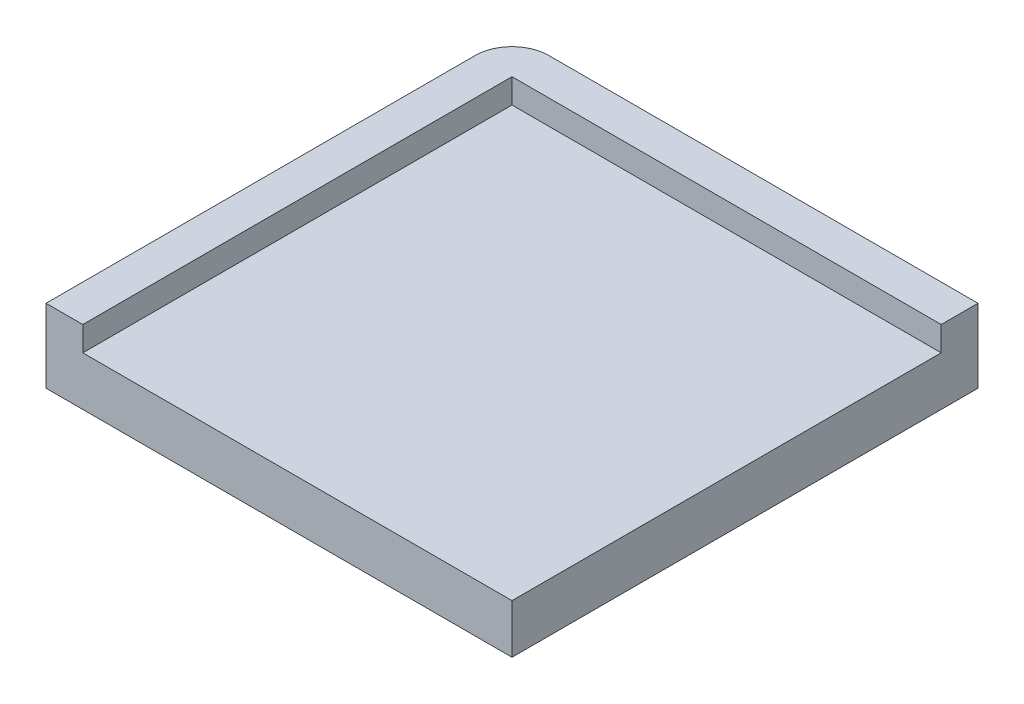
ISO-10303-21;
HEADER;
FILE_DESCRIPTION(('STEP AP214'),'2;1');
FILE_NAME('part.step','',(''),(''),'','','');
FILE_SCHEMA(('AUTOMOTIVE_DESIGN { 1 0 10303 214 1 1 1 1 }'));
ENDSEC;
DATA;
#1=APPLICATION_CONTEXT('core data for automotive mechanical design processes');
#2=APPLICATION_PROTOCOL_DEFINITION('international standard','automotive_design',2000,#1);
#3=PRODUCT_CONTEXT('',#1,'mechanical');
#4=PRODUCT('Part','Part','',(#3));
#5=PRODUCT_RELATED_PRODUCT_CATEGORY('part','',(#4));
#6=PRODUCT_DEFINITION_FORMATION('','',#4);
#7=PRODUCT_DEFINITION_CONTEXT('part definition',#1,'design');
#8=PRODUCT_DEFINITION('design','',#6,#7);
#9=PRODUCT_DEFINITION_SHAPE('','',#8);
#10=(LENGTH_UNIT() NAMED_UNIT(*) SI_UNIT(.MILLI.,.METRE.));
#11=(NAMED_UNIT(*) PLANE_ANGLE_UNIT() SI_UNIT($,.RADIAN.));
#12=(NAMED_UNIT(*) SI_UNIT($,.STERADIAN.) SOLID_ANGLE_UNIT());
#13=UNCERTAINTY_MEASURE_WITH_UNIT(LENGTH_MEASURE(1.E-05),#10,'distance_accuracy_value','');
#14=(GEOMETRIC_REPRESENTATION_CONTEXT(3) GLOBAL_UNCERTAINTY_ASSIGNED_CONTEXT((#13)) GLOBAL_UNIT_ASSIGNED_CONTEXT((#10,
#11,#12)) REPRESENTATION_CONTEXT('',''));
#15=CARTESIAN_POINT('',(0.,0.,0.));
#16=DIRECTION('',(0.,0.,1.));
#17=DIRECTION('',(1.,0.,0.));
#18=AXIS2_PLACEMENT_3D('',#15,#16,#17);
#19=CARTESIAN_POINT('',(-19.,4.,19.));
#20=DIRECTION('',(1.,0.,0.));
#21=DIRECTION('',(0.,0.,-1.));
#22=AXIS2_PLACEMENT_3D('',#19,#20,#21);
#23=PLANE('',#22);
#24=DIRECTION('',(0.,0.,1.));
#25=VECTOR('',#24,1.);
#26=CARTESIAN_POINT('',(-19.,6.,19.));
#27=LINE('',#26,#25);
#28=CARTESIAN_POINT('',(-19.,6.,-16.));
#29=VERTEX_POINT('',#28);
#30=CARTESIAN_POINT('',(-19.,6.,19.));
#31=VERTEX_POINT('',#30);
#32=EDGE_CURVE('E162',#29,#31,#27,.T.);
#33=ORIENTED_EDGE('',*,*,#32,.F.);
#34=DIRECTION('',(0.,-1.,0.));
#35=VECTOR('',#34,1.);
#36=CARTESIAN_POINT('',(-19.,4.,-16.));
#37=LINE('',#36,#35);
#38=CARTESIAN_POINT('',(-19.,0.,-16.));
#39=VERTEX_POINT('',#38);
#40=EDGE_CURVE('E154',#29,#39,#37,.T.);
#41=ORIENTED_EDGE('',*,*,#40,.T.);
#42=DIRECTION('',(0.,0.,1.));
#43=VECTOR('',#42,1.);
#44=CARTESIAN_POINT('',(-19.,0.,19.));
#45=LINE('',#44,#43);
#46=CARTESIAN_POINT('',(-19.,0.,19.));
#47=VERTEX_POINT('',#46);
#48=EDGE_CURVE('E128',#39,#47,#45,.T.);
#49=ORIENTED_EDGE('',*,*,#48,.T.);
#50=DIRECTION('',(0.,-1.,0.));
#51=VECTOR('',#50,1.);
#52=CARTESIAN_POINT('',(-19.,4.,19.));
#53=LINE('',#52,#51);
#54=EDGE_CURVE('E151',#31,#47,#53,.T.);
#55=ORIENTED_EDGE('',*,*,#54,.F.);
#56=EDGE_LOOP('',(#33,#41,#49,#55));
#57=FACE_BOUND('',#56,.T.);
#58=ADVANCED_FACE('F37',(#57),#23,.F.);
#59=CARTESIAN_POINT('',(19.,4.,19.));
#60=DIRECTION('',(0.,0.,-1.));
#61=DIRECTION('',(-1.,0.,0.));
#62=AXIS2_PLACEMENT_3D('',#59,#60,#61);
#63=PLANE('',#62);
#64=DIRECTION('',(1.,0.,0.));
#65=VECTOR('',#64,1.);
#66=CARTESIAN_POINT('',(19.,0.,19.));
#67=LINE('',#66,#65);
#68=CARTESIAN_POINT('',(19.,0.,19.));
#69=VERTEX_POINT('',#68);
#70=EDGE_CURVE('E130',#47,#69,#67,.T.);
#71=ORIENTED_EDGE('',*,*,#70,.T.);
#72=DIRECTION('',(0.,-1.,0.));
#73=VECTOR('',#72,1.);
#74=CARTESIAN_POINT('',(19.,4.,19.));
#75=LINE('',#74,#73);
#76=CARTESIAN_POINT('',(19.,4.,19.));
#77=VERTEX_POINT('',#76);
#78=EDGE_CURVE('E148',#77,#69,#75,.T.);
#79=ORIENTED_EDGE('',*,*,#78,.F.);
#80=DIRECTION('',(1.,0.,0.));
#81=VECTOR('',#80,1.);
#82=CARTESIAN_POINT('',(19.,4.,19.));
#83=LINE('',#82,#81);
#84=CARTESIAN_POINT('',(-16.,4.,19.));
#85=VERTEX_POINT('',#84);
#86=EDGE_CURVE('E136',#85,#77,#83,.T.);
#87=ORIENTED_EDGE('',*,*,#86,.F.);
#88=DIRECTION('',(0.,-1.,0.));
#89=VECTOR('',#88,1.);
#90=CARTESIAN_POINT('',(-16.,6.,19.));
#91=LINE('',#90,#89);
#92=CARTESIAN_POINT('',(-16.,6.,19.));
#93=VERTEX_POINT('',#92);
#94=EDGE_CURVE('E132',#93,#85,#91,.T.);
#95=ORIENTED_EDGE('',*,*,#94,.F.);
#96=DIRECTION('',(1.,0.,0.));
#97=VECTOR('',#96,1.);
#98=CARTESIAN_POINT('',(-16.,6.,19.));
#99=LINE('',#98,#97);
#100=EDGE_CURVE('E120',#31,#93,#99,.T.);
#101=ORIENTED_EDGE('',*,*,#100,.F.);
#102=ORIENTED_EDGE('',*,*,#54,.T.);
#103=EDGE_LOOP('',(#71,#79,#87,#95,#101,#102));
#104=FACE_BOUND('',#103,.T.);
#105=ADVANCED_FACE('F169',(#104),#63,.F.);
#106=CARTESIAN_POINT('',(19.,4.,19.));
#107=DIRECTION('',(-1.,0.,0.));
#108=DIRECTION('',(0.,0.,1.));
#109=AXIS2_PLACEMENT_3D('',#106,#107,#108);
#110=PLANE('',#109);
#111=DIRECTION('',(0.,0.,-1.));
#112=VECTOR('',#111,1.);
#113=CARTESIAN_POINT('',(19.,0.,19.));
#114=LINE('',#113,#112);
#115=CARTESIAN_POINT('',(19.,0.,-19.));
#116=VERTEX_POINT('',#115);
#117=EDGE_CURVE('E143',#69,#116,#114,.T.);
#118=ORIENTED_EDGE('',*,*,#117,.T.);
#119=DIRECTION('',(0.,-1.,0.));
#120=VECTOR('',#119,1.);
#121=CARTESIAN_POINT('',(19.,4.,-19.));
#122=LINE('',#121,#120);
#123=CARTESIAN_POINT('',(19.,6.,-19.));
#124=VERTEX_POINT('',#123);
#125=EDGE_CURVE('E140',#124,#116,#122,.T.);
#126=ORIENTED_EDGE('',*,*,#125,.F.);
#127=DIRECTION('',(0.,0.,-1.));
#128=VECTOR('',#127,1.);
#129=CARTESIAN_POINT('',(19.,6.,-19.));
#130=LINE('',#129,#128);
#131=CARTESIAN_POINT('',(19.,6.,-16.));
#132=VERTEX_POINT('',#131);
#133=EDGE_CURVE('E114',#132,#124,#130,.T.);
#134=ORIENTED_EDGE('',*,*,#133,.F.);
#135=DIRECTION('',(0.,-1.,0.));
#136=VECTOR('',#135,1.);
#137=CARTESIAN_POINT('',(19.,6.,-16.));
#138=LINE('',#137,#136);
#139=CARTESIAN_POINT('',(19.,4.,-16.));
#140=VERTEX_POINT('',#139);
#141=EDGE_CURVE('E110',#132,#140,#138,.T.);
#142=ORIENTED_EDGE('',*,*,#141,.T.);
#143=DIRECTION('',(0.,0.,-1.));
#144=VECTOR('',#143,1.);
#145=CARTESIAN_POINT('',(19.,4.,19.));
#146=LINE('',#145,#144);
#147=EDGE_CURVE('E138',#77,#140,#146,.T.);
#148=ORIENTED_EDGE('',*,*,#147,.F.);
#149=ORIENTED_EDGE('',*,*,#78,.T.);
#150=EDGE_LOOP('',(#118,#126,#134,#142,#148,#149));
#151=FACE_BOUND('',#150,.T.);
#152=ADVANCED_FACE('F180',(#151),#110,.F.);
#153=CARTESIAN_POINT('',(19.,4.,-19.));
#154=DIRECTION('',(0.,0.,1.));
#155=DIRECTION('',(1.,0.,0.));
#156=AXIS2_PLACEMENT_3D('',#153,#154,#155);
#157=PLANE('',#156);
#158=DIRECTION('',(-1.,0.,0.));
#159=VECTOR('',#158,1.);
#160=CARTESIAN_POINT('',(19.,0.,-19.));
#161=LINE('',#160,#159);
#162=CARTESIAN_POINT('',(-16.,0.,-19.));
#163=VERTEX_POINT('',#162);
#164=EDGE_CURVE('E139',#116,#163,#161,.T.);
#165=ORIENTED_EDGE('',*,*,#164,.T.);
#166=DIRECTION('',(0.,-1.,0.));
#167=VECTOR('',#166,1.);
#168=CARTESIAN_POINT('',(-16.,4.,-19.));
#169=LINE('',#168,#167);
#170=CARTESIAN_POINT('',(-16.,6.,-19.));
#171=VERTEX_POINT('',#170);
#172=EDGE_CURVE('E45',#163,#171,#169,.F.);
#173=ORIENTED_EDGE('',*,*,#172,.T.);
#174=DIRECTION('',(-1.,0.,0.));
#175=VECTOR('',#174,1.);
#176=CARTESIAN_POINT('',(-19.,6.,-19.));
#177=LINE('',#176,#175);
#178=EDGE_CURVE('E172',#124,#171,#177,.T.);
#179=ORIENTED_EDGE('',*,*,#178,.F.);
#180=ORIENTED_EDGE('',*,*,#125,.T.);
#181=EDGE_LOOP('',(#165,#173,#179,#180));
#182=FACE_BOUND('',#181,.T.);
#183=ADVANCED_FACE('F195',(#182),#157,.F.);
#184=CARTESIAN_POINT('',(0.,4.,0.));
#185=DIRECTION('',(0.,1.,0.));
#186=DIRECTION('',(0.,0.,1.));
#187=AXIS2_PLACEMENT_3D('',#184,#185,#186);
#188=PLANE('',#187);
#189=DIRECTION('',(0.,0.,-1.));
#190=VECTOR('',#189,1.);
#191=CARTESIAN_POINT('',(-16.,4.,-16.));
#192=LINE('',#191,#190);
#193=CARTESIAN_POINT('',(-16.,4.,-16.));
#194=VERTEX_POINT('',#193);
#195=EDGE_CURVE('E127',#85,#194,#192,.T.);
#196=ORIENTED_EDGE('',*,*,#195,.F.);
#197=ORIENTED_EDGE('',*,*,#86,.T.);
#198=ORIENTED_EDGE('',*,*,#147,.T.);
#199=DIRECTION('',(1.,0.,0.));
#200=VECTOR('',#199,1.);
#201=CARTESIAN_POINT('',(19.,4.,-16.));
#202=LINE('',#201,#200);
#203=EDGE_CURVE('E124',#194,#140,#202,.T.);
#204=ORIENTED_EDGE('',*,*,#203,.F.);
#205=EDGE_LOOP('',(#196,#197,#198,#204));
#206=FACE_BOUND('',#205,.T.);
#207=ADVANCED_FACE('F198',(#206),#188,.T.);
#208=CARTESIAN_POINT('',(0.,0.,0.));
#209=DIRECTION('',(0.,1.,0.));
#210=DIRECTION('',(0.,0.,1.));
#211=AXIS2_PLACEMENT_3D('',#208,#209,#210);
#212=PLANE('',#211);
#213=ORIENTED_EDGE('',*,*,#48,.F.);
#214=CARTESIAN_POINT('',(-16.,0.,-16.));
#215=DIRECTION('',(0.,1.,0.));
#216=DIRECTION('',(0.,0.,1.));
#217=AXIS2_PLACEMENT_3D('',#214,#215,#216);
#218=CIRCLE('',#217,3.);
#219=EDGE_CURVE('E59',#39,#163,#218,.F.);
#220=ORIENTED_EDGE('',*,*,#219,.T.);
#221=ORIENTED_EDGE('',*,*,#164,.F.);
#222=ORIENTED_EDGE('',*,*,#117,.F.);
#223=ORIENTED_EDGE('',*,*,#70,.F.);
#224=EDGE_LOOP('',(#213,#220,#221,#222,#223));
#225=FACE_BOUND('',#224,.T.);
#226=ADVANCED_FACE('F165',(#225),#212,.F.);
#227=CARTESIAN_POINT('',(-16.,6.,-16.));
#228=DIRECTION('',(-1.,0.,0.));
#229=DIRECTION('',(0.,0.,1.));
#230=AXIS2_PLACEMENT_3D('',#227,#228,#229);
#231=PLANE('',#230);
#232=ORIENTED_EDGE('',*,*,#195,.T.);
#233=DIRECTION('',(0.,-1.,0.));
#234=VECTOR('',#233,1.);
#235=CARTESIAN_POINT('',(-16.,6.,-16.));
#236=LINE('',#235,#234);
#237=CARTESIAN_POINT('',(-16.,6.,-16.));
#238=VERTEX_POINT('',#237);
#239=EDGE_CURVE('E107',#238,#194,#236,.T.);
#240=ORIENTED_EDGE('',*,*,#239,.F.);
#241=DIRECTION('',(0.,0.,-1.));
#242=VECTOR('',#241,1.);
#243=CARTESIAN_POINT('',(-16.,6.,-16.));
#244=LINE('',#243,#242);
#245=EDGE_CURVE('E115',#93,#238,#244,.T.);
#246=ORIENTED_EDGE('',*,*,#245,.F.);
#247=ORIENTED_EDGE('',*,*,#94,.T.);
#248=EDGE_LOOP('',(#232,#240,#246,#247));
#249=FACE_BOUND('',#248,.T.);
#250=ADVANCED_FACE('F126',(#249),#231,.F.);
#251=CARTESIAN_POINT('',(19.,6.,-16.));
#252=DIRECTION('',(0.,0.,-1.));
#253=DIRECTION('',(-1.,0.,0.));
#254=AXIS2_PLACEMENT_3D('',#251,#252,#253);
#255=PLANE('',#254);
#256=ORIENTED_EDGE('',*,*,#203,.T.);
#257=ORIENTED_EDGE('',*,*,#141,.F.);
#258=DIRECTION('',(1.,0.,0.));
#259=VECTOR('',#258,1.);
#260=CARTESIAN_POINT('',(19.,6.,-16.));
#261=LINE('',#260,#259);
#262=EDGE_CURVE('E102',#238,#132,#261,.T.);
#263=ORIENTED_EDGE('',*,*,#262,.F.);
#264=ORIENTED_EDGE('',*,*,#239,.T.);
#265=EDGE_LOOP('',(#256,#257,#263,#264));
#266=FACE_BOUND('',#265,.T.);
#267=ADVANCED_FACE('F105',(#266),#255,.F.);
#268=CARTESIAN_POINT('',(0.,6.,0.));
#269=DIRECTION('',(0.,-1.,0.));
#270=DIRECTION('',(0.,0.,-1.));
#271=AXIS2_PLACEMENT_3D('',#268,#269,#270);
#272=PLANE('',#271);
#273=ORIENTED_EDGE('',*,*,#178,.T.);
#274=CARTESIAN_POINT('',(-16.,6.,-16.));
#275=DIRECTION('',(0.,-1.,0.));
#276=DIRECTION('',(0.,0.,-1.));
#277=AXIS2_PLACEMENT_3D('',#274,#275,#276);
#278=CIRCLE('',#277,3.);
#279=EDGE_CURVE('E11',#171,#29,#278,.F.);
#280=ORIENTED_EDGE('',*,*,#279,.T.);
#281=ORIENTED_EDGE('',*,*,#32,.T.);
#282=ORIENTED_EDGE('',*,*,#100,.T.);
#283=ORIENTED_EDGE('',*,*,#245,.T.);
#284=ORIENTED_EDGE('',*,*,#262,.T.);
#285=ORIENTED_EDGE('',*,*,#133,.T.);
#286=EDGE_LOOP('',(#273,#280,#281,#282,#283,#284,#285));
#287=FACE_BOUND('',#286,.T.);
#288=ADVANCED_FACE('F118',(#287),#272,.F.);
#289=CARTESIAN_POINT('',(-16.,4.,-16.));
#290=DIRECTION('',(0.,-1.,0.));
#291=DIRECTION('',(0.,0.,-1.));
#292=AXIS2_PLACEMENT_3D('',#289,#290,#291);
#293=CYLINDRICAL_SURFACE('',#292,3.);
#294=ORIENTED_EDGE('',*,*,#279,.F.);
#295=ORIENTED_EDGE('',*,*,#172,.F.);
#296=ORIENTED_EDGE('',*,*,#219,.F.);
#297=ORIENTED_EDGE('',*,*,#40,.F.);
#298=EDGE_LOOP('',(#294,#295,#296,#297));
#299=FACE_BOUND('',#298,.T.);
#300=ADVANCED_FACE('F39',(#299),#293,.T.);
#301=CLOSED_SHELL('',(#58,#105,#152,#183,#207,#226,#250,#267,#288,#300));
#302=MANIFOLD_SOLID_BREP('B2',#301);
#303=ADVANCED_BREP_SHAPE_REPRESENTATION('',(#18,#302),#14);
#304=SHAPE_DEFINITION_REPRESENTATION(#9,#303);
ENDSEC;
END-ISO-10303-21;
